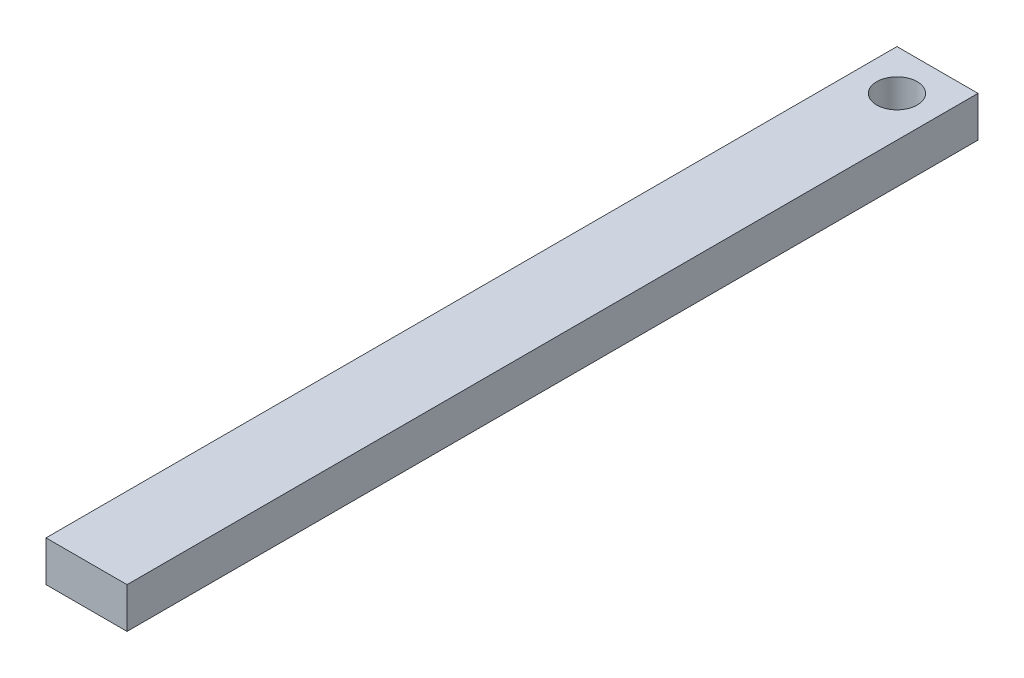
ISO-10303-21;
HEADER;
FILE_DESCRIPTION(('STEP AP214'),'2;1');
FILE_NAME('part.step','',(''),(''),'','','');
FILE_SCHEMA(('AUTOMOTIVE_DESIGN { 1 0 10303 214 1 1 1 1 }'));
ENDSEC;
DATA;
#1=APPLICATION_CONTEXT('core data for automotive mechanical design processes');
#2=APPLICATION_PROTOCOL_DEFINITION('international standard','automotive_design',2000,#1);
#3=PRODUCT_CONTEXT('',#1,'mechanical');
#4=PRODUCT('Part','Part','',(#3));
#5=PRODUCT_RELATED_PRODUCT_CATEGORY('part','',(#4));
#6=PRODUCT_DEFINITION_FORMATION('','',#4);
#7=PRODUCT_DEFINITION_CONTEXT('part definition',#1,'design');
#8=PRODUCT_DEFINITION('design','',#6,#7);
#9=PRODUCT_DEFINITION_SHAPE('','',#8);
#10=(LENGTH_UNIT() NAMED_UNIT(*) SI_UNIT(.MILLI.,.METRE.));
#11=(NAMED_UNIT(*) PLANE_ANGLE_UNIT() SI_UNIT($,.RADIAN.));
#12=(NAMED_UNIT(*) SI_UNIT($,.STERADIAN.) SOLID_ANGLE_UNIT());
#13=UNCERTAINTY_MEASURE_WITH_UNIT(LENGTH_MEASURE(1.E-05),#10,'distance_accuracy_value','');
#14=(GEOMETRIC_REPRESENTATION_CONTEXT(3) GLOBAL_UNCERTAINTY_ASSIGNED_CONTEXT((#13)) GLOBAL_UNIT_ASSIGNED_CONTEXT((#10,
#11,#12)) REPRESENTATION_CONTEXT('',''));
#15=CARTESIAN_POINT('',(0.,0.,0.));
#16=DIRECTION('',(0.,0.,1.));
#17=DIRECTION('',(1.,0.,0.));
#18=AXIS2_PLACEMENT_3D('',#15,#16,#17);
#19=CARTESIAN_POINT('',(-10.,10.,0.));
#20=DIRECTION('',(1.,0.,0.));
#21=DIRECTION('',(0.,0.,-1.));
#22=AXIS2_PLACEMENT_3D('',#19,#20,#21);
#23=PLANE('',#22);
#24=DIRECTION('',(0.,0.,1.));
#25=VECTOR('',#24,1.);
#26=CARTESIAN_POINT('',(-10.,0.,0.));
#27=LINE('',#26,#25);
#28=CARTESIAN_POINT('',(-10.,0.,0.));
#29=VERTEX_POINT('',#28);
#30=CARTESIAN_POINT('',(-9.99999999999997,0.,210.));
#31=VERTEX_POINT('',#30);
#32=EDGE_CURVE('E111',#29,#31,#27,.T.);
#33=ORIENTED_EDGE('',*,*,#32,.T.);
#34=DIRECTION('',(0.,-1.,0.));
#35=VECTOR('',#34,1.);
#36=CARTESIAN_POINT('',(-9.99999999999997,10.,210.));
#37=LINE('',#36,#35);
#38=CARTESIAN_POINT('',(-9.99999999999997,10.,210.));
#39=VERTEX_POINT('',#38);
#40=EDGE_CURVE('E11',#39,#31,#37,.T.);
#41=ORIENTED_EDGE('',*,*,#40,.F.);
#42=DIRECTION('',(0.,0.,1.));
#43=VECTOR('',#42,1.);
#44=CARTESIAN_POINT('',(-10.,10.,0.));
#45=LINE('',#44,#43);
#46=CARTESIAN_POINT('',(-10.,10.,0.));
#47=VERTEX_POINT('',#46);
#48=EDGE_CURVE('E95',#47,#39,#45,.T.);
#49=ORIENTED_EDGE('',*,*,#48,.F.);
#50=DIRECTION('',(0.,-1.,0.));
#51=VECTOR('',#50,1.);
#52=CARTESIAN_POINT('',(-10.,10.,0.));
#53=LINE('',#52,#51);
#54=EDGE_CURVE('E107',#47,#29,#53,.T.);
#55=ORIENTED_EDGE('',*,*,#54,.T.);
#56=EDGE_LOOP('',(#33,#41,#49,#55));
#57=FACE_BOUND('',#56,.T.);
#58=ADVANCED_FACE('F43',(#57),#23,.F.);
#59=CARTESIAN_POINT('',(-9.99999999999997,10.,210.));
#60=DIRECTION('',(0.,0.,-1.));
#61=DIRECTION('',(-1.,0.,0.));
#62=AXIS2_PLACEMENT_3D('',#59,#60,#61);
#63=PLANE('',#62);
#64=DIRECTION('',(1.,0.,0.));
#65=VECTOR('',#64,1.);
#66=CARTESIAN_POINT('',(-9.99999999999997,0.,210.));
#67=LINE('',#66,#65);
#68=CARTESIAN_POINT('',(10.,0.,210.));
#69=VERTEX_POINT('',#68);
#70=EDGE_CURVE('E100',#31,#69,#67,.T.);
#71=ORIENTED_EDGE('',*,*,#70,.T.);
#72=DIRECTION('',(0.,-1.,0.));
#73=VECTOR('',#72,1.);
#74=CARTESIAN_POINT('',(10.,10.,210.));
#75=LINE('',#74,#73);
#76=CARTESIAN_POINT('',(10.,10.,210.));
#77=VERTEX_POINT('',#76);
#78=EDGE_CURVE('E52',#77,#69,#75,.T.);
#79=ORIENTED_EDGE('',*,*,#78,.F.);
#80=DIRECTION('',(1.,0.,0.));
#81=VECTOR('',#80,1.);
#82=CARTESIAN_POINT('',(-9.99999999999997,10.,210.));
#83=LINE('',#82,#81);
#84=EDGE_CURVE('E90',#39,#77,#83,.T.);
#85=ORIENTED_EDGE('',*,*,#84,.F.);
#86=ORIENTED_EDGE('',*,*,#40,.T.);
#87=EDGE_LOOP('',(#71,#79,#85,#86));
#88=FACE_BOUND('',#87,.T.);
#89=ADVANCED_FACE('F99',(#88),#63,.F.);
#90=CARTESIAN_POINT('',(10.,10.,0.));
#91=DIRECTION('',(-1.,0.,0.));
#92=DIRECTION('',(0.,0.,1.));
#93=AXIS2_PLACEMENT_3D('',#90,#91,#92);
#94=PLANE('',#93);
#95=DIRECTION('',(0.,0.,-1.));
#96=VECTOR('',#95,1.);
#97=CARTESIAN_POINT('',(10.,0.,0.));
#98=LINE('',#97,#96);
#99=CARTESIAN_POINT('',(10.,0.,0.));
#100=VERTEX_POINT('',#99);
#101=EDGE_CURVE('E77',#69,#100,#98,.T.);
#102=ORIENTED_EDGE('',*,*,#101,.T.);
#103=DIRECTION('',(0.,-1.,0.));
#104=VECTOR('',#103,1.);
#105=CARTESIAN_POINT('',(10.,10.,0.));
#106=LINE('',#105,#104);
#107=CARTESIAN_POINT('',(10.,10.,0.));
#108=VERTEX_POINT('',#107);
#109=EDGE_CURVE('E102',#108,#100,#106,.T.);
#110=ORIENTED_EDGE('',*,*,#109,.F.);
#111=DIRECTION('',(0.,0.,-1.));
#112=VECTOR('',#111,1.);
#113=CARTESIAN_POINT('',(10.,10.,0.));
#114=LINE('',#113,#112);
#115=EDGE_CURVE('E93',#77,#108,#114,.T.);
#116=ORIENTED_EDGE('',*,*,#115,.F.);
#117=ORIENTED_EDGE('',*,*,#78,.T.);
#118=EDGE_LOOP('',(#102,#110,#116,#117));
#119=FACE_BOUND('',#118,.T.);
#120=ADVANCED_FACE('F103',(#119),#94,.F.);
#121=CARTESIAN_POINT('',(10.,10.,0.));
#122=DIRECTION('',(0.,0.,1.));
#123=DIRECTION('',(1.,0.,0.));
#124=AXIS2_PLACEMENT_3D('',#121,#122,#123);
#125=PLANE('',#124);
#126=DIRECTION('',(-1.,0.,0.));
#127=VECTOR('',#126,1.);
#128=CARTESIAN_POINT('',(10.,0.,0.));
#129=LINE('',#128,#127);
#130=EDGE_CURVE('E83',#100,#29,#129,.T.);
#131=ORIENTED_EDGE('',*,*,#130,.T.);
#132=ORIENTED_EDGE('',*,*,#54,.F.);
#133=DIRECTION('',(-1.,0.,0.));
#134=VECTOR('',#133,1.);
#135=CARTESIAN_POINT('',(10.,10.,0.));
#136=LINE('',#135,#134);
#137=EDGE_CURVE('E60',#108,#47,#136,.T.);
#138=ORIENTED_EDGE('',*,*,#137,.F.);
#139=ORIENTED_EDGE('',*,*,#109,.T.);
#140=EDGE_LOOP('',(#131,#132,#138,#139));
#141=FACE_BOUND('',#140,.T.);
#142=ADVANCED_FACE('F125',(#141),#125,.F.);
#143=CARTESIAN_POINT('',(0.,10.,0.));
#144=DIRECTION('',(0.,1.,0.));
#145=DIRECTION('',(0.,0.,1.));
#146=AXIS2_PLACEMENT_3D('',#143,#144,#145);
#147=PLANE('',#146);
#148=CARTESIAN_POINT('',(0.,10.,10.));
#149=DIRECTION('',(0.,1.,0.));
#150=DIRECTION('',(0.,0.,1.));
#151=AXIS2_PLACEMENT_3D('',#148,#149,#150);
#152=CIRCLE('',#151,5.);
#153=CARTESIAN_POINT('',(0.,10.,15.));
#154=VERTEX_POINT('',#153);
#155=EDGE_CURVE('E132',#154,#154,#152,.T.);
#156=ORIENTED_EDGE('',*,*,#155,.F.);
#157=EDGE_LOOP('',(#156));
#158=FACE_BOUND('',#157,.T.);
#159=ORIENTED_EDGE('',*,*,#48,.T.);
#160=ORIENTED_EDGE('',*,*,#84,.T.);
#161=ORIENTED_EDGE('',*,*,#115,.T.);
#162=ORIENTED_EDGE('',*,*,#137,.T.);
#163=EDGE_LOOP('',(#159,#160,#161,#162));
#164=FACE_BOUND('',#163,.T.);
#165=ADVANCED_FACE('F91',(#158,#164),#147,.T.);
#166=CARTESIAN_POINT('',(0.,0.,0.));
#167=DIRECTION('',(0.,1.,0.));
#168=DIRECTION('',(0.,0.,1.));
#169=AXIS2_PLACEMENT_3D('',#166,#167,#168);
#170=PLANE('',#169);
#171=CARTESIAN_POINT('',(0.,0.,10.));
#172=DIRECTION('',(0.,1.,0.));
#173=DIRECTION('',(0.,0.,1.));
#174=AXIS2_PLACEMENT_3D('',#171,#172,#173);
#175=CIRCLE('',#174,5.);
#176=CARTESIAN_POINT('',(0.,0.,15.));
#177=VERTEX_POINT('',#176);
#178=EDGE_CURVE('E115',#177,#177,#175,.T.);
#179=ORIENTED_EDGE('',*,*,#178,.T.);
#180=EDGE_LOOP('',(#179));
#181=FACE_BOUND('',#180,.T.);
#182=ORIENTED_EDGE('',*,*,#32,.F.);
#183=ORIENTED_EDGE('',*,*,#130,.F.);
#184=ORIENTED_EDGE('',*,*,#101,.F.);
#185=ORIENTED_EDGE('',*,*,#70,.F.);
#186=EDGE_LOOP('',(#182,#183,#184,#185));
#187=FACE_BOUND('',#186,.T.);
#188=ADVANCED_FACE('F128',(#181,#187),#170,.F.);
#189=CARTESIAN_POINT('',(0.,0.,10.));
#190=DIRECTION('',(0.,1.,0.));
#191=DIRECTION('',(0.,0.,1.));
#192=AXIS2_PLACEMENT_3D('',#189,#190,#191);
#193=CYLINDRICAL_SURFACE('',#192,5.);
#194=ORIENTED_EDGE('',*,*,#178,.F.);
#195=EDGE_LOOP('',(#194));
#196=FACE_BOUND('',#195,.T.);
#197=ORIENTED_EDGE('',*,*,#155,.T.);
#198=EDGE_LOOP('',(#197));
#199=FACE_BOUND('',#198,.T.);
#200=ADVANCED_FACE('F141',(#196,#199),#193,.F.);
#201=CLOSED_SHELL('',(#58,#89,#120,#142,#165,#188,#200));
#202=MANIFOLD_SOLID_BREP('B2',#201);
#203=ADVANCED_BREP_SHAPE_REPRESENTATION('',(#18,#202),#14);
#204=SHAPE_DEFINITION_REPRESENTATION(#9,#203);
ENDSEC;
END-ISO-10303-21;
